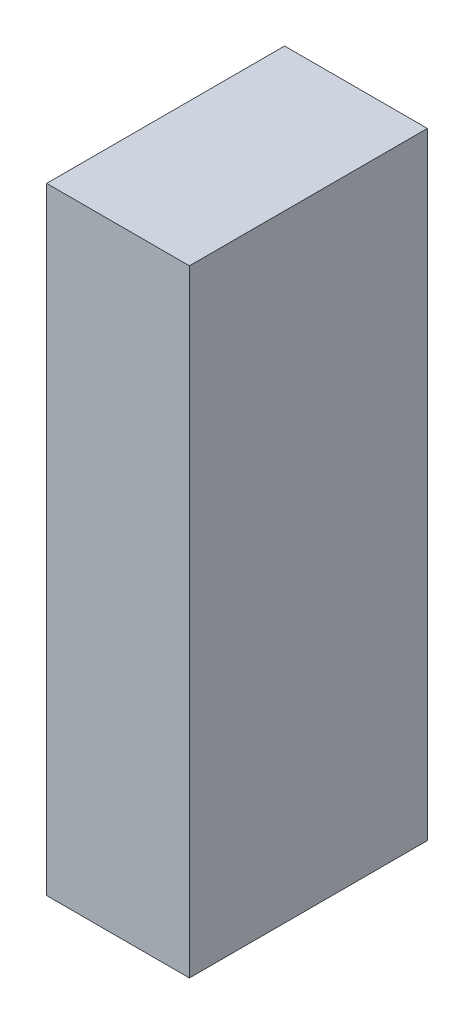
ISO-10303-21;
HEADER;
FILE_DESCRIPTION(('STEP AP214'),'2;1');
FILE_NAME('part.step','',(''),(''),'','','');
FILE_SCHEMA(('AUTOMOTIVE_DESIGN { 1 0 10303 214 1 1 1 1 }'));
ENDSEC;
DATA;
#1=APPLICATION_CONTEXT('core data for automotive mechanical design processes');
#2=APPLICATION_PROTOCOL_DEFINITION('international standard','automotive_design',2000,#1);
#3=PRODUCT_CONTEXT('',#1,'mechanical');
#4=PRODUCT('Part','Part','',(#3));
#5=PRODUCT_RELATED_PRODUCT_CATEGORY('part','',(#4));
#6=PRODUCT_DEFINITION_FORMATION('','',#4);
#7=PRODUCT_DEFINITION_CONTEXT('part definition',#1,'design');
#8=PRODUCT_DEFINITION('design','',#6,#7);
#9=PRODUCT_DEFINITION_SHAPE('','',#8);
#10=(LENGTH_UNIT() NAMED_UNIT(*) SI_UNIT(.MILLI.,.METRE.));
#11=(NAMED_UNIT(*) PLANE_ANGLE_UNIT() SI_UNIT($,.RADIAN.));
#12=(NAMED_UNIT(*) SI_UNIT($,.STERADIAN.) SOLID_ANGLE_UNIT());
#13=UNCERTAINTY_MEASURE_WITH_UNIT(LENGTH_MEASURE(1.E-05),#10,'distance_accuracy_value','');
#14=(GEOMETRIC_REPRESENTATION_CONTEXT(3) GLOBAL_UNCERTAINTY_ASSIGNED_CONTEXT((#13)) GLOBAL_UNIT_ASSIGNED_CONTEXT((#10,
#11,#12)) REPRESENTATION_CONTEXT('',''));
#15=CARTESIAN_POINT('',(0.,0.,0.));
#16=DIRECTION('',(0.,0.,1.));
#17=DIRECTION('',(1.,0.,0.));
#18=AXIS2_PLACEMENT_3D('',#15,#16,#17);
#19=CARTESIAN_POINT('',(0.,0.,0.));
#20=DIRECTION('',(1.,0.,0.));
#21=DIRECTION('',(0.,0.,1.));
#22=AXIS2_PLACEMENT_3D('',#19,#20,#21);
#23=PLANE('',#22);
#24=DIRECTION('',(0.,1.,0.));
#25=VECTOR('',#24,1.);
#26=CARTESIAN_POINT('',(0.,0.,1.25));
#27=LINE('',#26,#25);
#28=CARTESIAN_POINT('',(0.,0.,1.25));
#29=VERTEX_POINT('',#28);
#30=CARTESIAN_POINT('',(0.,3.24,1.25));
#31=VERTEX_POINT('',#30);
#32=EDGE_CURVE('E11',#29,#31,#27,.T.);
#33=ORIENTED_EDGE('',*,*,#32,.T.);
#34=DIRECTION('',(0.,0.,1.));
#35=VECTOR('',#34,1.);
#36=CARTESIAN_POINT('',(0.,3.24,0.));
#37=LINE('',#36,#35);
#38=CARTESIAN_POINT('',(0.,3.24,0.));
#39=VERTEX_POINT('',#38);
#40=EDGE_CURVE('E23',#39,#31,#37,.T.);
#41=ORIENTED_EDGE('',*,*,#40,.F.);
#42=DIRECTION('',(0.,1.,0.));
#43=VECTOR('',#42,1.);
#44=CARTESIAN_POINT('',(0.,0.,0.));
#45=LINE('',#44,#43);
#46=CARTESIAN_POINT('',(0.,0.,0.));
#47=VERTEX_POINT('',#46);
#48=EDGE_CURVE('E85',#47,#39,#45,.T.);
#49=ORIENTED_EDGE('',*,*,#48,.F.);
#50=DIRECTION('',(0.,0.,1.));
#51=VECTOR('',#50,1.);
#52=CARTESIAN_POINT('',(0.,0.,0.));
#53=LINE('',#52,#51);
#54=EDGE_CURVE('E35',#47,#29,#53,.T.);
#55=ORIENTED_EDGE('',*,*,#54,.T.);
#56=EDGE_LOOP('',(#33,#41,#49,#55));
#57=FACE_BOUND('',#56,.T.);
#58=ADVANCED_FACE('F16',(#57),#23,.F.);
#59=CARTESIAN_POINT('',(0.75,0.,0.));
#60=DIRECTION('',(1.,0.,0.));
#61=DIRECTION('',(0.,0.,1.));
#62=AXIS2_PLACEMENT_3D('',#59,#60,#61);
#63=PLANE('',#62);
#64=DIRECTION('',(0.,0.,1.));
#65=VECTOR('',#64,1.);
#66=CARTESIAN_POINT('',(0.75,0.,0.));
#67=LINE('',#66,#65);
#68=CARTESIAN_POINT('',(0.75,0.,0.));
#69=VERTEX_POINT('',#68);
#70=CARTESIAN_POINT('',(0.75,0.,1.25));
#71=VERTEX_POINT('',#70);
#72=EDGE_CURVE('E82',#69,#71,#67,.T.);
#73=ORIENTED_EDGE('',*,*,#72,.F.);
#74=DIRECTION('',(0.,1.,0.));
#75=VECTOR('',#74,1.);
#76=CARTESIAN_POINT('',(0.75,0.,0.));
#77=LINE('',#76,#75);
#78=CARTESIAN_POINT('',(0.75,3.24,0.));
#79=VERTEX_POINT('',#78);
#80=EDGE_CURVE('E62',#69,#79,#77,.T.);
#81=ORIENTED_EDGE('',*,*,#80,.T.);
#82=DIRECTION('',(0.,0.,1.));
#83=VECTOR('',#82,1.);
#84=CARTESIAN_POINT('',(0.75,3.24,0.));
#85=LINE('',#84,#83);
#86=CARTESIAN_POINT('',(0.75,3.24,1.25));
#87=VERTEX_POINT('',#86);
#88=EDGE_CURVE('E56',#79,#87,#85,.T.);
#89=ORIENTED_EDGE('',*,*,#88,.T.);
#90=DIRECTION('',(0.,1.,0.));
#91=VECTOR('',#90,1.);
#92=CARTESIAN_POINT('',(0.75,0.,1.25));
#93=LINE('',#92,#91);
#94=EDGE_CURVE('E59',#71,#87,#93,.T.);
#95=ORIENTED_EDGE('',*,*,#94,.F.);
#96=EDGE_LOOP('',(#73,#81,#89,#95));
#97=FACE_BOUND('',#96,.T.);
#98=ADVANCED_FACE('F58',(#97),#63,.T.);
#99=CARTESIAN_POINT('',(0.,0.,0.));
#100=DIRECTION('',(0.,1.,0.));
#101=DIRECTION('',(0.,0.,1.));
#102=AXIS2_PLACEMENT_3D('',#99,#100,#101);
#103=PLANE('',#102);
#104=ORIENTED_EDGE('',*,*,#72,.T.);
#105=DIRECTION('',(1.,0.,0.));
#106=VECTOR('',#105,1.);
#107=CARTESIAN_POINT('',(0.,0.,1.25));
#108=LINE('',#107,#106);
#109=EDGE_CURVE('E70',#29,#71,#108,.T.);
#110=ORIENTED_EDGE('',*,*,#109,.F.);
#111=ORIENTED_EDGE('',*,*,#54,.F.);
#112=DIRECTION('',(1.,0.,0.));
#113=VECTOR('',#112,1.);
#114=CARTESIAN_POINT('',(0.,0.,0.));
#115=LINE('',#114,#113);
#116=EDGE_CURVE('E75',#47,#69,#115,.T.);
#117=ORIENTED_EDGE('',*,*,#116,.T.);
#118=EDGE_LOOP('',(#104,#110,#111,#117));
#119=FACE_BOUND('',#118,.T.);
#120=ADVANCED_FACE('F90',(#119),#103,.F.);
#121=CARTESIAN_POINT('',(0.,3.24,0.));
#122=DIRECTION('',(0.,1.,0.));
#123=DIRECTION('',(0.,0.,1.));
#124=AXIS2_PLACEMENT_3D('',#121,#122,#123);
#125=PLANE('',#124);
#126=DIRECTION('',(1.,0.,0.));
#127=VECTOR('',#126,1.);
#128=CARTESIAN_POINT('',(0.,3.24,0.));
#129=LINE('',#128,#127);
#130=EDGE_CURVE('E73',#39,#79,#129,.T.);
#131=ORIENTED_EDGE('',*,*,#130,.F.);
#132=ORIENTED_EDGE('',*,*,#40,.T.);
#133=DIRECTION('',(1.,0.,0.));
#134=VECTOR('',#133,1.);
#135=CARTESIAN_POINT('',(0.,3.24,1.25));
#136=LINE('',#135,#134);
#137=EDGE_CURVE('E68',#31,#87,#136,.T.);
#138=ORIENTED_EDGE('',*,*,#137,.T.);
#139=ORIENTED_EDGE('',*,*,#88,.F.);
#140=EDGE_LOOP('',(#131,#132,#138,#139));
#141=FACE_BOUND('',#140,.T.);
#142=ADVANCED_FACE('F72',(#141),#125,.T.);
#143=CARTESIAN_POINT('',(0.,0.,0.));
#144=DIRECTION('',(0.,0.,1.));
#145=DIRECTION('',(1.,0.,0.));
#146=AXIS2_PLACEMENT_3D('',#143,#144,#145);
#147=PLANE('',#146);
#148=ORIENTED_EDGE('',*,*,#130,.T.);
#149=ORIENTED_EDGE('',*,*,#80,.F.);
#150=ORIENTED_EDGE('',*,*,#116,.F.);
#151=ORIENTED_EDGE('',*,*,#48,.T.);
#152=EDGE_LOOP('',(#148,#149,#150,#151));
#153=FACE_BOUND('',#152,.T.);
#154=ADVANCED_FACE('F88',(#153),#147,.F.);
#155=CARTESIAN_POINT('',(0.,0.,1.25));
#156=DIRECTION('',(0.,0.,1.));
#157=DIRECTION('',(1.,0.,0.));
#158=AXIS2_PLACEMENT_3D('',#155,#156,#157);
#159=PLANE('',#158);
#160=ORIENTED_EDGE('',*,*,#32,.F.);
#161=ORIENTED_EDGE('',*,*,#109,.T.);
#162=ORIENTED_EDGE('',*,*,#94,.T.);
#163=ORIENTED_EDGE('',*,*,#137,.F.);
#164=EDGE_LOOP('',(#160,#161,#162,#163));
#165=FACE_BOUND('',#164,.T.);
#166=ADVANCED_FACE('F67',(#165),#159,.T.);
#167=CLOSED_SHELL('',(#58,#98,#120,#142,#154,#166));
#168=MANIFOLD_SOLID_BREP('B1',#167);
#169=ADVANCED_BREP_SHAPE_REPRESENTATION('',(#18,#168),#14);
#170=SHAPE_DEFINITION_REPRESENTATION(#9,#169);
ENDSEC;
END-ISO-10303-21;
